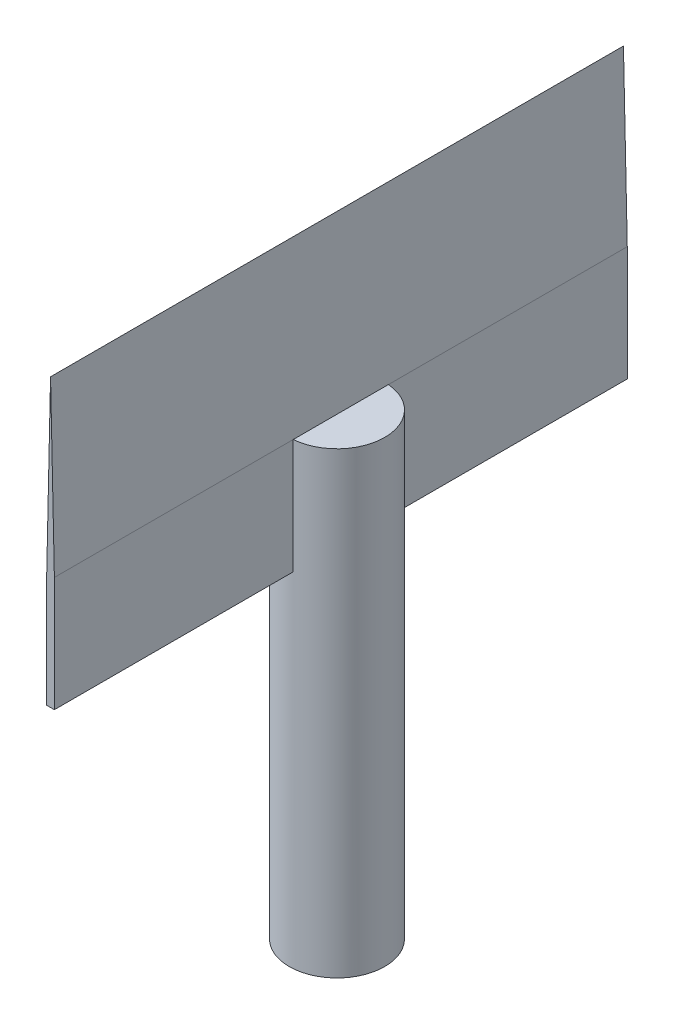
ISO-10303-21;
HEADER;
FILE_DESCRIPTION(('STEP AP214'),'2;1');
FILE_NAME('part.step','',(''),(''),'','','');
FILE_SCHEMA(('AUTOMOTIVE_DESIGN { 1 0 10303 214 1 1 1 1 }'));
ENDSEC;
DATA;
#1=APPLICATION_CONTEXT('core data for automotive mechanical design processes');
#2=APPLICATION_PROTOCOL_DEFINITION('international standard','automotive_design',2000,#1);
#3=PRODUCT_CONTEXT('',#1,'mechanical');
#4=PRODUCT('Part','Part','',(#3));
#5=PRODUCT_RELATED_PRODUCT_CATEGORY('part','',(#4));
#6=PRODUCT_DEFINITION_FORMATION('','',#4);
#7=PRODUCT_DEFINITION_CONTEXT('part definition',#1,'design');
#8=PRODUCT_DEFINITION('design','',#6,#7);
#9=PRODUCT_DEFINITION_SHAPE('','',#8);
#10=(LENGTH_UNIT() NAMED_UNIT(*) SI_UNIT(.MILLI.,.METRE.));
#11=(NAMED_UNIT(*) PLANE_ANGLE_UNIT() SI_UNIT($,.RADIAN.));
#12=(NAMED_UNIT(*) SI_UNIT($,.STERADIAN.) SOLID_ANGLE_UNIT());
#13=UNCERTAINTY_MEASURE_WITH_UNIT(LENGTH_MEASURE(1.E-05),#10,'distance_accuracy_value','');
#14=(GEOMETRIC_REPRESENTATION_CONTEXT(3) GLOBAL_UNCERTAINTY_ASSIGNED_CONTEXT((#13)) GLOBAL_UNIT_ASSIGNED_CONTEXT((#10,
#11,#12)) REPRESENTATION_CONTEXT('',''));
#15=CARTESIAN_POINT('',(0.,0.,0.));
#16=DIRECTION('',(0.,0.,1.));
#17=DIRECTION('',(1.,0.,0.));
#18=AXIS2_PLACEMENT_3D('',#15,#16,#17);
#19=CARTESIAN_POINT('',(0.,90.,0.));
#20=DIRECTION('',(0.,-1.,0.));
#21=DIRECTION('',(0.,0.,-1.));
#22=AXIS2_PLACEMENT_3D('',#19,#20,#21);
#23=CYLINDRICAL_SURFACE('',#22,12.5);
#24=CARTESIAN_POINT('',(0.,0.,0.));
#25=DIRECTION('',(0.,1.,0.));
#26=DIRECTION('',(0.,0.,1.));
#27=AXIS2_PLACEMENT_3D('',#24,#25,#26);
#28=CIRCLE('',#27,12.5);
#29=CARTESIAN_POINT('',(0.,0.,12.5));
#30=VERTEX_POINT('',#29);
#31=EDGE_CURVE('E175',#30,#30,#28,.T.);
#32=ORIENTED_EDGE('',*,*,#31,.T.);
#33=EDGE_LOOP('',(#32));
#34=FACE_BOUND('',#33,.T.);
#35=DIRECTION('',(0.,-1.,0.));
#36=VECTOR('',#35,1.);
#37=CARTESIAN_POINT('',(-1.,90.,-12.4599357943771));
#38=LINE('',#37,#36);
#39=CARTESIAN_POINT('',(-1.,90.,-12.4599357943771));
#40=VERTEX_POINT('',#39);
#41=CARTESIAN_POINT('',(-1.,120.,-12.4599357943771));
#42=VERTEX_POINT('',#41);
#43=EDGE_CURVE('E154',#40,#42,#38,.F.);
#44=ORIENTED_EDGE('',*,*,#43,.F.);
#45=CARTESIAN_POINT('',(0.,90.,0.));
#46=DIRECTION('',(0.,1.,0.));
#47=DIRECTION('',(0.,0.,1.));
#48=AXIS2_PLACEMENT_3D('',#45,#46,#47);
#49=CIRCLE('',#48,12.5);
#50=CARTESIAN_POINT('',(1.,90.,-12.4599357943771));
#51=VERTEX_POINT('',#50);
#52=EDGE_CURVE('E11',#51,#40,#49,.T.);
#53=ORIENTED_EDGE('',*,*,#52,.F.);
#54=DIRECTION('',(0.,-1.,0.));
#55=VECTOR('',#54,1.);
#56=CARTESIAN_POINT('',(1.,90.,-12.4599357943771));
#57=LINE('',#56,#55);
#58=CARTESIAN_POINT('',(1.,120.,-12.4599357943771));
#59=VERTEX_POINT('',#58);
#60=EDGE_CURVE('E146',#59,#51,#57,.T.);
#61=ORIENTED_EDGE('',*,*,#60,.F.);
#62=CARTESIAN_POINT('',(0.,120.,0.));
#63=DIRECTION('',(0.,1.,0.));
#64=DIRECTION('',(0.,0.,1.));
#65=AXIS2_PLACEMENT_3D('',#62,#63,#64);
#66=CIRCLE('',#65,12.5);
#67=CARTESIAN_POINT('',(1.,120.,12.4599357943771));
#68=VERTEX_POINT('',#67);
#69=EDGE_CURVE('E161',#68,#59,#66,.T.);
#70=ORIENTED_EDGE('',*,*,#69,.F.);
#71=DIRECTION('',(0.,-1.,0.));
#72=VECTOR('',#71,1.);
#73=CARTESIAN_POINT('',(1.,90.,12.4599357943771));
#74=LINE('',#73,#72);
#75=CARTESIAN_POINT('',(1.,90.,12.4599357943771));
#76=VERTEX_POINT('',#75);
#77=EDGE_CURVE('E141',#76,#68,#74,.F.);
#78=ORIENTED_EDGE('',*,*,#77,.F.);
#79=CARTESIAN_POINT('',(-1.,90.,12.4599357943771));
#80=VERTEX_POINT('',#79);
#81=EDGE_CURVE('E48',#80,#76,#49,.T.);
#82=ORIENTED_EDGE('',*,*,#81,.F.);
#83=DIRECTION('',(0.,-1.,0.));
#84=VECTOR('',#83,1.);
#85=CARTESIAN_POINT('',(-1.,90.,12.4599357943771));
#86=LINE('',#85,#84);
#87=CARTESIAN_POINT('',(-1.,120.,12.4599357943771));
#88=VERTEX_POINT('',#87);
#89=EDGE_CURVE('E143',#88,#80,#86,.T.);
#90=ORIENTED_EDGE('',*,*,#89,.F.);
#91=EDGE_CURVE('E159',#42,#88,#66,.T.);
#92=ORIENTED_EDGE('',*,*,#91,.F.);
#93=EDGE_LOOP('',(#44,#53,#61,#70,#78,#82,#90,#92));
#94=FACE_BOUND('',#93,.T.);
#95=ADVANCED_FACE('F44',(#34,#94),#23,.T.);
#96=CARTESIAN_POINT('',(0.,120.,0.));
#97=DIRECTION('',(0.,1.,0.));
#98=DIRECTION('',(0.,0.,1.));
#99=AXIS2_PLACEMENT_3D('',#96,#97,#98);
#100=PLANE('',#99);
#101=ORIENTED_EDGE('',*,*,#69,.T.);
#102=DIRECTION('',(0.,0.,1.));
#103=VECTOR('',#102,1.);
#104=CARTESIAN_POINT('',(1.,120.,0.));
#105=LINE('',#104,#103);
#106=EDGE_CURVE('E177',#59,#68,#105,.T.);
#107=ORIENTED_EDGE('',*,*,#106,.T.);
#108=EDGE_LOOP('',(#101,#107));
#109=FACE_BOUND('',#108,.T.);
#110=ADVANCED_FACE('F197',(#109),#100,.T.);
#111=ORIENTED_EDGE('',*,*,#91,.T.);
#112=DIRECTION('',(0.,0.,-1.));
#113=VECTOR('',#112,1.);
#114=CARTESIAN_POINT('',(-1.,120.,0.));
#115=LINE('',#114,#113);
#116=EDGE_CURVE('E180',#88,#42,#115,.T.);
#117=ORIENTED_EDGE('',*,*,#116,.T.);
#118=EDGE_LOOP('',(#111,#117));
#119=FACE_BOUND('',#118,.T.);
#120=ADVANCED_FACE('F200',(#119),#100,.T.);
#121=CARTESIAN_POINT('',(0.,0.,0.));
#122=DIRECTION('',(0.,1.,0.));
#123=DIRECTION('',(0.,0.,1.));
#124=AXIS2_PLACEMENT_3D('',#121,#122,#123);
#125=PLANE('',#124);
#126=ORIENTED_EDGE('',*,*,#31,.F.);
#127=EDGE_LOOP('',(#126));
#128=FACE_BOUND('',#127,.T.);
#129=CARTESIAN_POINT('',(0.,0.,0.));
#130=DIRECTION('',(0.,1.,0.));
#131=DIRECTION('',(0.,0.,1.));
#132=AXIS2_PLACEMENT_3D('',#129,#130,#131);
#133=CIRCLE('',#132,10.);
#134=CARTESIAN_POINT('',(0.,0.,-10.));
#135=VERTEX_POINT('',#134);
#136=EDGE_CURVE('E166',#135,#135,#133,.T.);
#137=ORIENTED_EDGE('',*,*,#136,.T.);
#138=EDGE_LOOP('',(#137));
#139=FACE_BOUND('',#138,.T.);
#140=ADVANCED_FACE('F202',(#128,#139),#125,.F.);
#141=CARTESIAN_POINT('',(0.,90.,0.));
#142=DIRECTION('',(0.,-1.,0.));
#143=DIRECTION('',(0.,0.,-1.));
#144=AXIS2_PLACEMENT_3D('',#141,#142,#143);
#145=CYLINDRICAL_SURFACE('',#144,10.);
#146=CARTESIAN_POINT('',(0.,90.,0.));
#147=DIRECTION('',(0.,1.,0.));
#148=DIRECTION('',(0.,0.,1.));
#149=AXIS2_PLACEMENT_3D('',#146,#147,#148);
#150=CIRCLE('',#149,10.);
#151=CARTESIAN_POINT('',(0.,90.,-10.));
#152=VERTEX_POINT('',#151);
#153=EDGE_CURVE('E164',#152,#152,#150,.T.);
#154=CARTESIAN_POINT('',(0.,90.,-10.));
#155=CARTESIAN_POINT('',(0.,89.0625,-10.));
#156=CARTESIAN_POINT('',(0.,88.125,-10.));
#157=CARTESIAN_POINT('',(0.,86.25,-10.));
#158=CARTESIAN_POINT('',(0.,85.3125,-10.));
#159=CARTESIAN_POINT('',(0.,83.4375,-10.));
#160=CARTESIAN_POINT('',(0.,82.5,-10.));
#161=CARTESIAN_POINT('',(0.,80.625,-10.));
#162=CARTESIAN_POINT('',(0.,79.6875,-10.));
#163=CARTESIAN_POINT('',(0.,77.8125,-10.));
#164=CARTESIAN_POINT('',(0.,76.875,-10.));
#165=CARTESIAN_POINT('',(0.,75.,-10.));
#166=CARTESIAN_POINT('',(0.,74.0625,-10.));
#167=CARTESIAN_POINT('',(0.,72.1875,-10.));
#168=CARTESIAN_POINT('',(0.,71.25,-10.));
#169=CARTESIAN_POINT('',(0.,69.375,-10.));
#170=CARTESIAN_POINT('',(0.,68.4375,-10.));
#171=CARTESIAN_POINT('',(0.,66.5625,-10.));
#172=CARTESIAN_POINT('',(0.,65.625,-10.));
#173=CARTESIAN_POINT('',(0.,63.75,-10.));
#174=CARTESIAN_POINT('',(0.,62.8125,-10.));
#175=CARTESIAN_POINT('',(0.,60.9375,-10.));
#176=CARTESIAN_POINT('',(0.,60.,-10.));
#177=CARTESIAN_POINT('',(0.,58.125,-10.));
#178=CARTESIAN_POINT('',(0.,57.1875,-10.));
#179=CARTESIAN_POINT('',(0.,55.3125,-10.));
#180=CARTESIAN_POINT('',(0.,54.375,-10.));
#181=CARTESIAN_POINT('',(0.,52.5,-10.));
#182=CARTESIAN_POINT('',(0.,51.5625,-10.));
#183=CARTESIAN_POINT('',(0.,49.6875,-10.));
#184=CARTESIAN_POINT('',(0.,48.75,-10.));
#185=CARTESIAN_POINT('',(0.,46.875,-10.));
#186=CARTESIAN_POINT('',(0.,45.9375,-10.));
#187=CARTESIAN_POINT('',(0.,44.0625,-10.));
#188=CARTESIAN_POINT('',(0.,43.125,-10.));
#189=CARTESIAN_POINT('',(0.,41.25,-10.));
#190=CARTESIAN_POINT('',(0.,40.3125,-10.));
#191=CARTESIAN_POINT('',(0.,38.4375,-10.));
#192=CARTESIAN_POINT('',(0.,37.5,-10.));
#193=CARTESIAN_POINT('',(0.,35.625,-10.));
#194=CARTESIAN_POINT('',(0.,34.6875,-10.));
#195=CARTESIAN_POINT('',(0.,32.8125,-10.));
#196=CARTESIAN_POINT('',(0.,31.875,-10.));
#197=CARTESIAN_POINT('',(0.,30.,-10.));
#198=CARTESIAN_POINT('',(0.,29.0625,-10.));
#199=CARTESIAN_POINT('',(0.,27.1875,-10.));
#200=CARTESIAN_POINT('',(0.,26.25,-10.));
#201=CARTESIAN_POINT('',(0.,24.375,-10.));
#202=CARTESIAN_POINT('',(0.,23.4375,-10.));
#203=CARTESIAN_POINT('',(0.,21.5625,-10.));
#204=CARTESIAN_POINT('',(0.,20.625,-10.));
#205=CARTESIAN_POINT('',(0.,18.75,-10.));
#206=CARTESIAN_POINT('',(0.,17.8125,-10.));
#207=CARTESIAN_POINT('',(0.,15.9375,-10.));
#208=CARTESIAN_POINT('',(0.,15.,-10.));
#209=CARTESIAN_POINT('',(0.,13.125,-10.));
#210=CARTESIAN_POINT('',(0.,12.1875,-10.));
#211=CARTESIAN_POINT('',(0.,10.3125,-10.));
#212=CARTESIAN_POINT('',(0.,9.37499999999999,-10.));
#213=CARTESIAN_POINT('',(0.,7.49999999999999,-10.));
#214=CARTESIAN_POINT('',(0.,6.56249999999999,-10.));
#215=CARTESIAN_POINT('',(0.,4.68749999999999,-10.));
#216=CARTESIAN_POINT('',(0.,3.74999999999998,-10.));
#217=CARTESIAN_POINT('',(0.,1.87499999999998,-10.));
#218=CARTESIAN_POINT('',(0.,0.937499999999986,-10.));
#219=CARTESIAN_POINT('',(0.,0.,-10.));
#220=B_SPLINE_CURVE_WITH_KNOTS('',3,(#154,#155,#156,#157,#158,#159,#160,#161,#162,#163,#164,
#165,#166,#167,#168,#169,#170,#171,#172,#173,#174,#175,#176,#177,#178,#179,#180,#181,#182,#183,
#184,#185,#186,#187,#188,#189,#190,#191,#192,#193,#194,#195,#196,#197,#198,#199,#200,#201,#202,
#203,#204,#205,#206,#207,#208,#209,#210,#211,#212,#213,#214,#215,#216,#217,#218,#219),
.UNSPECIFIED.,.F.,.F.,(4,2,2,2,2,2,2,2,2,2,2,2,2,2,2,2,2,2,2,2,2,2,2,2,2,2,2,2,2,2,2,2,4),(0.,
2.81250000000001,5.62500000000001,8.43750000000001,11.25,14.0625,16.875,19.6875,22.5,25.3125,
28.125,30.9375,33.75,36.5625,39.375,42.1875,45.,47.8125,50.625,53.4375,56.25,59.0625,61.875,
64.6875,67.5,70.3125,73.125,75.9375,78.75,81.5625,84.375,87.1875,90.),.UNSPECIFIED.);
#221=EDGE_CURVE('BSEAM214',#152,#135,#220,.T.);
#222=ORIENTED_EDGE('',*,*,#153,.T.);
#223=ORIENTED_EDGE('',*,*,#136,.F.);
#224=ORIENTED_EDGE('',*,*,#221,.T.);
#225=ORIENTED_EDGE('',*,*,#221,.F.);
#226=EDGE_LOOP('',(#222,#224,#223,#225));
#227=FACE_BOUND('',#226,.T.);
#228=ADVANCED_FACE('F214',(#227),#145,.F.);
#229=CARTESIAN_POINT('',(0.,90.,0.));
#230=DIRECTION('',(0.,1.,0.));
#231=DIRECTION('',(0.,0.,1.));
#232=AXIS2_PLACEMENT_3D('',#229,#230,#231);
#233=PLANE('',#232);
#234=ORIENTED_EDGE('',*,*,#153,.F.);
#235=EDGE_LOOP('',(#234));
#236=FACE_BOUND('',#235,.T.);
#237=ADVANCED_FACE('F211',(#236),#233,.F.);
#238=CARTESIAN_POINT('',(-1.,90.,75.));
#239=DIRECTION('',(0.,1.,0.));
#240=DIRECTION('',(0.,0.,1.));
#241=AXIS2_PLACEMENT_3D('',#238,#239,#240);
#242=PLANE('',#241);
#243=DIRECTION('',(0.,0.,-1.));
#244=VECTOR('',#243,1.);
#245=CARTESIAN_POINT('',(1.,90.,75.));
#246=LINE('',#245,#244);
#247=CARTESIAN_POINT('',(1.,90.,-75.));
#248=VERTEX_POINT('',#247);
#249=EDGE_CURVE('E194',#51,#248,#246,.T.);
#250=ORIENTED_EDGE('',*,*,#249,.F.);
#251=ORIENTED_EDGE('',*,*,#52,.T.);
#252=DIRECTION('',(0.,0.,-1.));
#253=VECTOR('',#252,1.);
#254=CARTESIAN_POINT('',(-1.,90.,75.));
#255=LINE('',#254,#253);
#256=CARTESIAN_POINT('',(-1.,90.,-75.));
#257=VERTEX_POINT('',#256);
#258=EDGE_CURVE('E145',#40,#257,#255,.T.);
#259=ORIENTED_EDGE('',*,*,#258,.T.);
#260=DIRECTION('',(1.,0.,0.));
#261=VECTOR('',#260,1.);
#262=CARTESIAN_POINT('',(-1.,90.,-75.));
#263=LINE('',#262,#261);
#264=EDGE_CURVE('E335',#257,#248,#263,.T.);
#265=ORIENTED_EDGE('',*,*,#264,.T.);
#266=EDGE_LOOP('',(#250,#251,#259,#265));
#267=FACE_BOUND('',#266,.T.);
#268=ADVANCED_FACE('F212',(#267),#242,.F.);
#269=CARTESIAN_POINT('',(-1.,90.,75.));
#270=DIRECTION('',(1.,0.,0.));
#271=DIRECTION('',(0.,1.,0.));
#272=AXIS2_PLACEMENT_3D('',#269,#270,#271);
#273=PLANE('',#272);
#274=DIRECTION('',(0.,0.,-1.));
#275=VECTOR('',#274,1.);
#276=CARTESIAN_POINT('',(-1.,120.,75.));
#277=LINE('',#276,#275);
#278=CARTESIAN_POINT('',(-1.,120.,75.));
#279=VERTEX_POINT('',#278);
#280=EDGE_CURVE('E349',#279,#88,#277,.T.);
#281=ORIENTED_EDGE('',*,*,#280,.T.);
#282=ORIENTED_EDGE('',*,*,#89,.T.);
#283=CARTESIAN_POINT('',(-1.,90.,75.));
#284=VERTEX_POINT('',#283);
#285=EDGE_CURVE('E118',#284,#80,#255,.T.);
#286=ORIENTED_EDGE('',*,*,#285,.F.);
#287=DIRECTION('',(0.,-1.,0.));
#288=VECTOR('',#287,1.);
#289=CARTESIAN_POINT('',(-1.,90.,75.));
#290=LINE('',#289,#288);
#291=EDGE_CURVE('E130',#279,#284,#290,.T.);
#292=ORIENTED_EDGE('',*,*,#291,.F.);
#293=EDGE_LOOP('',(#281,#282,#286,#292));
#294=FACE_BOUND('',#293,.T.);
#295=ADVANCED_FACE('F139',(#294),#273,.F.);
#296=ORIENTED_EDGE('',*,*,#258,.F.);
#297=ORIENTED_EDGE('',*,*,#43,.T.);
#298=CARTESIAN_POINT('',(-1.,120.,-75.));
#299=VERTEX_POINT('',#298);
#300=EDGE_CURVE('E58',#42,#299,#277,.T.);
#301=ORIENTED_EDGE('',*,*,#300,.T.);
#302=DIRECTION('',(0.,-1.,0.));
#303=VECTOR('',#302,1.);
#304=CARTESIAN_POINT('',(-1.,90.,-75.));
#305=LINE('',#304,#303);
#306=EDGE_CURVE('E327',#299,#257,#305,.T.);
#307=ORIENTED_EDGE('',*,*,#306,.T.);
#308=EDGE_LOOP('',(#296,#297,#301,#307));
#309=FACE_BOUND('',#308,.T.);
#310=ADVANCED_FACE('F251',(#309),#273,.F.);
#311=CARTESIAN_POINT('',(1.,90.,75.));
#312=DIRECTION('',(-1.,0.,0.));
#313=DIRECTION('',(0.,-1.,0.));
#314=AXIS2_PLACEMENT_3D('',#311,#312,#313);
#315=PLANE('',#314);
#316=DIRECTION('',(0.,0.,-1.));
#317=VECTOR('',#316,1.);
#318=CARTESIAN_POINT('',(1.,120.,75.));
#319=LINE('',#318,#317);
#320=CARTESIAN_POINT('',(1.,120.,-75.));
#321=VERTEX_POINT('',#320);
#322=EDGE_CURVE('E352',#59,#321,#319,.T.);
#323=ORIENTED_EDGE('',*,*,#322,.F.);
#324=ORIENTED_EDGE('',*,*,#60,.T.);
#325=ORIENTED_EDGE('',*,*,#249,.T.);
#326=DIRECTION('',(0.,1.,0.));
#327=VECTOR('',#326,1.);
#328=CARTESIAN_POINT('',(1.,90.,-75.));
#329=LINE('',#328,#327);
#330=EDGE_CURVE('E339',#248,#321,#329,.T.);
#331=ORIENTED_EDGE('',*,*,#330,.T.);
#332=EDGE_LOOP('',(#323,#324,#325,#331));
#333=FACE_BOUND('',#332,.T.);
#334=ADVANCED_FACE('F261',(#333),#315,.F.);
#335=CARTESIAN_POINT('',(1.,90.,75.));
#336=VERTEX_POINT('',#335);
#337=EDGE_CURVE('E125',#336,#76,#246,.T.);
#338=ORIENTED_EDGE('',*,*,#337,.T.);
#339=ORIENTED_EDGE('',*,*,#77,.T.);
#340=CARTESIAN_POINT('',(1.,120.,75.));
#341=VERTEX_POINT('',#340);
#342=EDGE_CURVE('E358',#341,#68,#319,.T.);
#343=ORIENTED_EDGE('',*,*,#342,.F.);
#344=DIRECTION('',(0.,1.,0.));
#345=VECTOR('',#344,1.);
#346=CARTESIAN_POINT('',(1.,90.,75.));
#347=LINE('',#346,#345);
#348=EDGE_CURVE('E127',#336,#341,#347,.T.);
#349=ORIENTED_EDGE('',*,*,#348,.F.);
#350=EDGE_LOOP('',(#338,#339,#343,#349));
#351=FACE_BOUND('',#350,.T.);
#352=ADVANCED_FACE('F187',(#351),#315,.F.);
#353=ORIENTED_EDGE('',*,*,#285,.T.);
#354=ORIENTED_EDGE('',*,*,#81,.T.);
#355=ORIENTED_EDGE('',*,*,#337,.F.);
#356=DIRECTION('',(1.,0.,0.));
#357=VECTOR('',#356,1.);
#358=CARTESIAN_POINT('',(-1.,90.,75.));
#359=LINE('',#358,#357);
#360=EDGE_CURVE('E113',#284,#336,#359,.T.);
#361=ORIENTED_EDGE('',*,*,#360,.F.);
#362=EDGE_LOOP('',(#353,#354,#355,#361));
#363=FACE_BOUND('',#362,.T.);
#364=ADVANCED_FACE('F116',(#363),#242,.F.);
#365=CARTESIAN_POINT('',(0.,165.,75.));
#366=DIRECTION('',(-0.99975317783161,-0.0222167372851469,0.));
#367=DIRECTION('',(0.0222167372851469,-0.99975317783161,0.));
#368=AXIS2_PLACEMENT_3D('',#365,#366,#367);
#369=PLANE('',#368);
#370=DIRECTION('',(-0.0222167372851469,0.99975317783161,0.));
#371=VECTOR('',#370,1.);
#372=CARTESIAN_POINT('',(0.,165.,-75.));
#373=LINE('',#372,#371);
#374=CARTESIAN_POINT('',(0.,165.,-75.));
#375=VERTEX_POINT('',#374);
#376=EDGE_CURVE('E344',#321,#375,#373,.T.);
#377=ORIENTED_EDGE('',*,*,#376,.T.);
#378=DIRECTION('',(0.,0.,-1.));
#379=VECTOR('',#378,1.);
#380=CARTESIAN_POINT('',(0.,165.,75.));
#381=LINE('',#380,#379);
#382=CARTESIAN_POINT('',(0.,165.,75.));
#383=VERTEX_POINT('',#382);
#384=EDGE_CURVE('E351',#383,#375,#381,.T.);
#385=ORIENTED_EDGE('',*,*,#384,.F.);
#386=DIRECTION('',(-0.0222167372851469,0.99975317783161,0.));
#387=VECTOR('',#386,1.);
#388=CARTESIAN_POINT('',(0.,165.,75.));
#389=LINE('',#388,#387);
#390=EDGE_CURVE('E368',#341,#383,#389,.T.);
#391=ORIENTED_EDGE('',*,*,#390,.F.);
#392=ORIENTED_EDGE('',*,*,#342,.T.);
#393=ORIENTED_EDGE('',*,*,#106,.F.);
#394=ORIENTED_EDGE('',*,*,#322,.T.);
#395=EDGE_LOOP('',(#377,#385,#391,#392,#393,#394));
#396=FACE_BOUND('',#395,.T.);
#397=ADVANCED_FACE('F288',(#396),#369,.F.);
#398=CARTESIAN_POINT('',(-1.,120.,75.));
#399=DIRECTION('',(0.99975317783161,-0.0222167372851469,0.));
#400=DIRECTION('',(0.0222167372851469,0.99975317783161,0.));
#401=AXIS2_PLACEMENT_3D('',#398,#399,#400);
#402=PLANE('',#401);
#403=DIRECTION('',(-0.0222167372851469,-0.99975317783161,0.));
#404=VECTOR('',#403,1.);
#405=CARTESIAN_POINT('',(-1.,120.,-75.));
#406=LINE('',#405,#404);
#407=EDGE_CURVE('E140',#375,#299,#406,.T.);
#408=ORIENTED_EDGE('',*,*,#407,.T.);
#409=ORIENTED_EDGE('',*,*,#300,.F.);
#410=ORIENTED_EDGE('',*,*,#116,.F.);
#411=ORIENTED_EDGE('',*,*,#280,.F.);
#412=DIRECTION('',(-0.0222167372851469,-0.99975317783161,0.));
#413=VECTOR('',#412,1.);
#414=CARTESIAN_POINT('',(-1.,120.,75.));
#415=LINE('',#414,#413);
#416=EDGE_CURVE('E131',#383,#279,#415,.T.);
#417=ORIENTED_EDGE('',*,*,#416,.F.);
#418=ORIENTED_EDGE('',*,*,#384,.T.);
#419=EDGE_LOOP('',(#408,#409,#410,#411,#417,#418));
#420=FACE_BOUND('',#419,.T.);
#421=ADVANCED_FACE('F294',(#420),#402,.F.);
#422=CARTESIAN_POINT('',(0.,0.,75.));
#423=DIRECTION('',(0.,0.,-1.));
#424=DIRECTION('',(-1.,0.,0.));
#425=AXIS2_PLACEMENT_3D('',#422,#423,#424);
#426=PLANE('',#425);
#427=ORIENTED_EDGE('',*,*,#291,.T.);
#428=ORIENTED_EDGE('',*,*,#360,.T.);
#429=ORIENTED_EDGE('',*,*,#348,.T.);
#430=ORIENTED_EDGE('',*,*,#390,.T.);
#431=ORIENTED_EDGE('',*,*,#416,.T.);
#432=EDGE_LOOP('',(#427,#428,#429,#430,#431));
#433=FACE_BOUND('',#432,.T.);
#434=ADVANCED_FACE('F128',(#433),#426,.F.);
#435=CARTESIAN_POINT('',(0.,0.,-75.));
#436=DIRECTION('',(0.,0.,-1.));
#437=DIRECTION('',(-1.,0.,0.));
#438=AXIS2_PLACEMENT_3D('',#435,#436,#437);
#439=PLANE('',#438);
#440=ORIENTED_EDGE('',*,*,#306,.F.);
#441=ORIENTED_EDGE('',*,*,#407,.F.);
#442=ORIENTED_EDGE('',*,*,#376,.F.);
#443=ORIENTED_EDGE('',*,*,#330,.F.);
#444=ORIENTED_EDGE('',*,*,#264,.F.);
#445=EDGE_LOOP('',(#440,#441,#442,#443,#444));
#446=FACE_BOUND('',#445,.T.);
#447=ADVANCED_FACE('F315',(#446),#439,.T.);
#448=CLOSED_SHELL('',(#95,#110,#120,#140,#228,#237,#268,#295,#310,#334,#352,#364,#397,#421,#434,#447));
#449=MANIFOLD_SOLID_BREP('B2',#448);
#450=ADVANCED_BREP_SHAPE_REPRESENTATION('',(#18,#449),#14);
#451=SHAPE_DEFINITION_REPRESENTATION(#9,#450);
ENDSEC;
END-ISO-10303-21;
